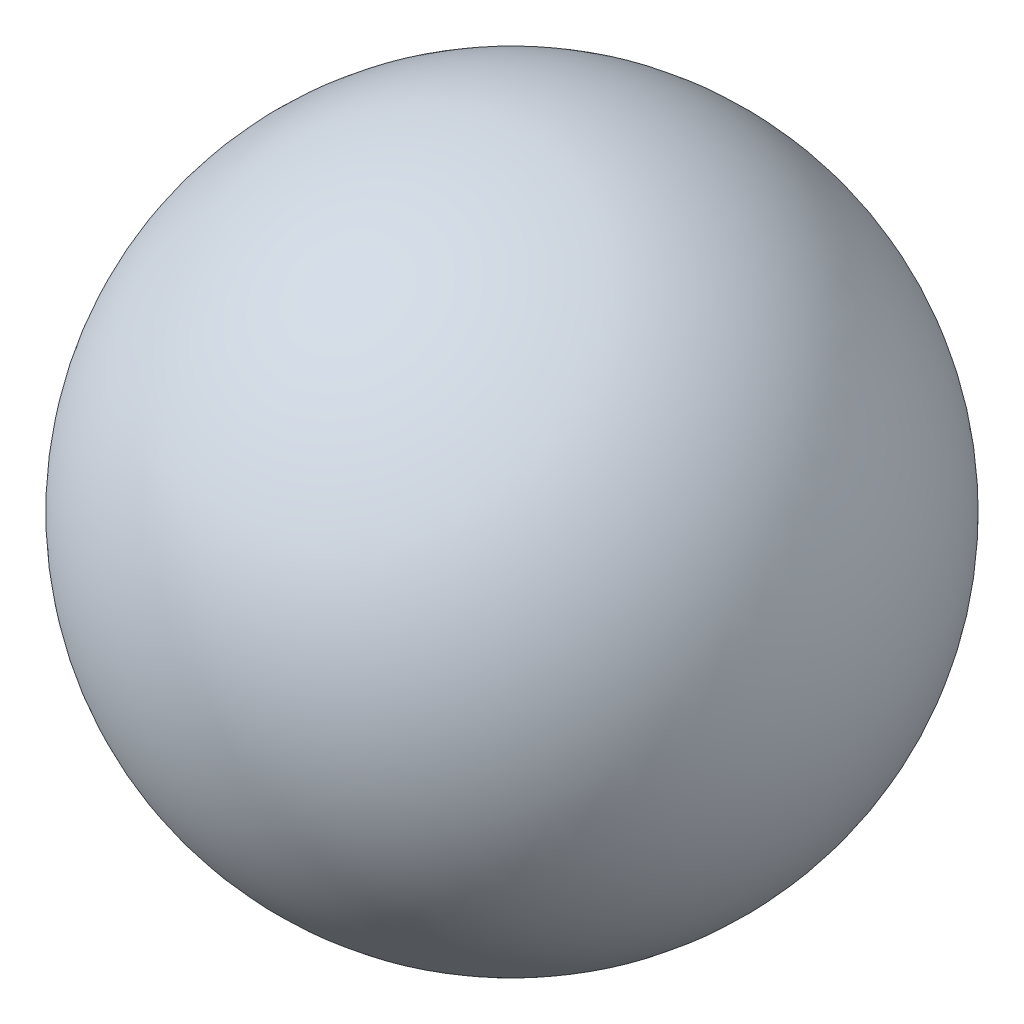
ISO-10303-21;
HEADER;
FILE_DESCRIPTION(('STEP AP214'),'2;1');
FILE_NAME('part.step','',(''),(''),'','','');
FILE_SCHEMA(('AUTOMOTIVE_DESIGN { 1 0 10303 214 1 1 1 1 }'));
ENDSEC;
DATA;
#1=APPLICATION_CONTEXT('core data for automotive mechanical design processes');
#2=APPLICATION_PROTOCOL_DEFINITION('international standard','automotive_design',2000,#1);
#3=PRODUCT_CONTEXT('',#1,'mechanical');
#4=PRODUCT('Part','Part','',(#3));
#5=PRODUCT_RELATED_PRODUCT_CATEGORY('part','',(#4));
#6=PRODUCT_DEFINITION_FORMATION('','',#4);
#7=PRODUCT_DEFINITION_CONTEXT('part definition',#1,'design');
#8=PRODUCT_DEFINITION('design','',#6,#7);
#9=PRODUCT_DEFINITION_SHAPE('','',#8);
#10=(LENGTH_UNIT() NAMED_UNIT(*) SI_UNIT(.MILLI.,.METRE.));
#11=(NAMED_UNIT(*) PLANE_ANGLE_UNIT() SI_UNIT($,.RADIAN.));
#12=(NAMED_UNIT(*) SI_UNIT($,.STERADIAN.) SOLID_ANGLE_UNIT());
#13=UNCERTAINTY_MEASURE_WITH_UNIT(LENGTH_MEASURE(1.E-05),#10,'distance_accuracy_value','');
#14=(GEOMETRIC_REPRESENTATION_CONTEXT(3) GLOBAL_UNCERTAINTY_ASSIGNED_CONTEXT((#13)) GLOBAL_UNIT_ASSIGNED_CONTEXT((#10,
#11,#12)) REPRESENTATION_CONTEXT('',''));
#15=CARTESIAN_POINT('',(0.,0.,0.));
#16=DIRECTION('',(0.,0.,1.));
#17=DIRECTION('',(1.,0.,0.));
#18=AXIS2_PLACEMENT_3D('',#15,#16,#17);
#19=CARTESIAN_POINT('',(0.,0.,0.));
#20=DIRECTION('',(0.,-1.,0.));
#21=DIRECTION('',(-1.,0.,0.));
#22=AXIS2_PLACEMENT_3D('',#19,#20,#21);
#23=SPHERICAL_SURFACE('',#22,100.);
#24=CARTESIAN_POINT('',(0.,-100.,0.));
#25=VERTEX_POINT('',#24);
#26=VERTEX_LOOP('',#25);
#27=FACE_BOUND('',#26,.T.);
#28=ADVANCED_FACE('F39',(#27),#23,.T.);
#29=CLOSED_SHELL('',(#28));
#30=MANIFOLD_SOLID_BREP('B2',#29);
#31=ADVANCED_BREP_SHAPE_REPRESENTATION('',(#18,#30),#14);
#32=SHAPE_DEFINITION_REPRESENTATION(#9,#31);
ENDSEC;
END-ISO-10303-21;
